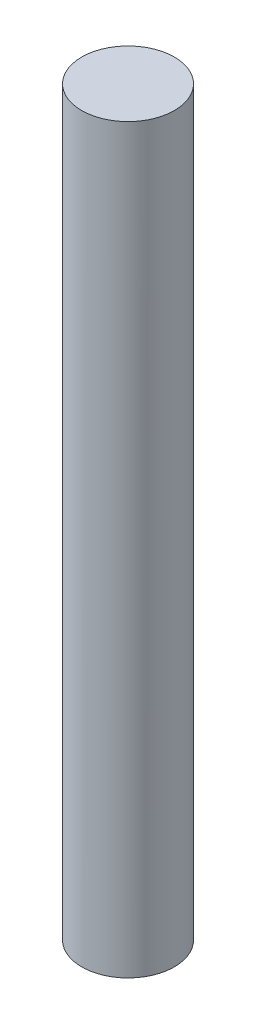
ISO-10303-21;
HEADER;
FILE_DESCRIPTION(('STEP AP214'),'2;1');
FILE_NAME('part.step','',(''),(''),'','','');
FILE_SCHEMA(('AUTOMOTIVE_DESIGN { 1 0 10303 214 1 1 1 1 }'));
ENDSEC;
DATA;
#1=APPLICATION_CONTEXT('core data for automotive mechanical design processes');
#2=APPLICATION_PROTOCOL_DEFINITION('international standard','automotive_design',2000,#1);
#3=PRODUCT_CONTEXT('',#1,'mechanical');
#4=PRODUCT('Part','Part','',(#3));
#5=PRODUCT_RELATED_PRODUCT_CATEGORY('part','',(#4));
#6=PRODUCT_DEFINITION_FORMATION('','',#4);
#7=PRODUCT_DEFINITION_CONTEXT('part definition',#1,'design');
#8=PRODUCT_DEFINITION('design','',#6,#7);
#9=PRODUCT_DEFINITION_SHAPE('','',#8);
#10=(LENGTH_UNIT() NAMED_UNIT(*) SI_UNIT(.MILLI.,.METRE.));
#11=(NAMED_UNIT(*) PLANE_ANGLE_UNIT() SI_UNIT($,.RADIAN.));
#12=(NAMED_UNIT(*) SI_UNIT($,.STERADIAN.) SOLID_ANGLE_UNIT());
#13=UNCERTAINTY_MEASURE_WITH_UNIT(LENGTH_MEASURE(1.E-05),#10,'distance_accuracy_value','');
#14=(GEOMETRIC_REPRESENTATION_CONTEXT(3) GLOBAL_UNCERTAINTY_ASSIGNED_CONTEXT((#13)) GLOBAL_UNIT_ASSIGNED_CONTEXT((#10,
#11,#12)) REPRESENTATION_CONTEXT('',''));
#15=CARTESIAN_POINT('',(0.,0.,0.));
#16=DIRECTION('',(0.,0.,1.));
#17=DIRECTION('',(1.,0.,0.));
#18=AXIS2_PLACEMENT_3D('',#15,#16,#17);
#19=CARTESIAN_POINT('',(0.,40.,0.));
#20=DIRECTION('',(0.,-1.,0.));
#21=DIRECTION('',(0.,0.,-1.));
#22=AXIS2_PLACEMENT_3D('',#19,#20,#21);
#23=CYLINDRICAL_SURFACE('',#22,7.5);
#24=CARTESIAN_POINT('',(0.,40.,0.));
#25=DIRECTION('',(0.,1.,0.));
#26=DIRECTION('',(0.,0.,1.));
#27=AXIS2_PLACEMENT_3D('',#24,#25,#26);
#28=CIRCLE('',#27,7.5);
#29=CARTESIAN_POINT('',(0.,40.,7.5));
#30=VERTEX_POINT('',#29);
#31=EDGE_CURVE('E10',#30,#30,#28,.T.);
#32=ORIENTED_EDGE('',*,*,#31,.F.);
#33=EDGE_LOOP('',(#32));
#34=FACE_BOUND('',#33,.T.);
#35=CARTESIAN_POINT('',(0.,-80.,0.));
#36=DIRECTION('',(0.,-1.,0.));
#37=DIRECTION('',(0.,0.,-1.));
#38=AXIS2_PLACEMENT_3D('',#35,#36,#37);
#39=CIRCLE('',#38,7.5);
#40=CARTESIAN_POINT('',(0.,-80.,-7.5));
#41=VERTEX_POINT('',#40);
#42=EDGE_CURVE('E37',#41,#41,#39,.T.);
#43=ORIENTED_EDGE('',*,*,#42,.F.);
#44=EDGE_LOOP('',(#43));
#45=FACE_BOUND('',#44,.T.);
#46=ADVANCED_FACE('F31',(#34,#45),#23,.T.);
#47=CARTESIAN_POINT('',(0.,40.,0.));
#48=DIRECTION('',(0.,1.,0.));
#49=DIRECTION('',(0.,0.,1.));
#50=AXIS2_PLACEMENT_3D('',#47,#48,#49);
#51=PLANE('',#50);
#52=ORIENTED_EDGE('',*,*,#31,.T.);
#53=EDGE_LOOP('',(#52));
#54=FACE_BOUND('',#53,.T.);
#55=ADVANCED_FACE('F46',(#54),#51,.T.);
#56=CARTESIAN_POINT('',(0.,-80.,0.));
#57=DIRECTION('',(0.,-1.,0.));
#58=DIRECTION('',(0.,0.,-1.));
#59=AXIS2_PLACEMENT_3D('',#56,#57,#58);
#60=PLANE('',#59);
#61=ORIENTED_EDGE('',*,*,#42,.T.);
#62=EDGE_LOOP('',(#61));
#63=FACE_BOUND('',#62,.T.);
#64=ADVANCED_FACE('F43',(#63),#60,.T.);
#65=CLOSED_SHELL('',(#46,#55,#64));
#66=MANIFOLD_SOLID_BREP('B2',#65);
#67=ADVANCED_BREP_SHAPE_REPRESENTATION('',(#18,#66),#14);
#68=SHAPE_DEFINITION_REPRESENTATION(#9,#67);
ENDSEC;
END-ISO-10303-21;
